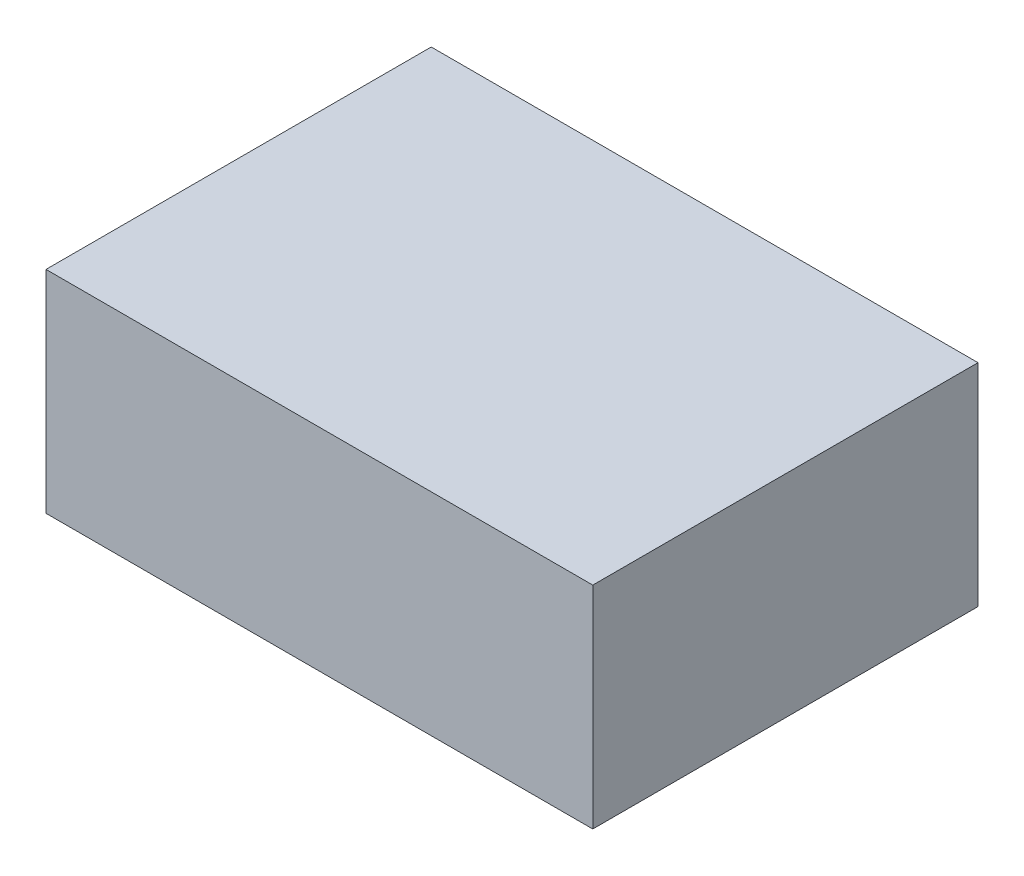
ISO-10303-21;
HEADER;
FILE_DESCRIPTION(('STEP AP214'),'2;1');
FILE_NAME('part.step','',(''),(''),'','','');
FILE_SCHEMA(('AUTOMOTIVE_DESIGN { 1 0 10303 214 1 1 1 1 }'));
ENDSEC;
DATA;
#1=APPLICATION_CONTEXT('core data for automotive mechanical design processes');
#2=APPLICATION_PROTOCOL_DEFINITION('international standard','automotive_design',2000,#1);
#3=PRODUCT_CONTEXT('',#1,'mechanical');
#4=PRODUCT('Part','Part','',(#3));
#5=PRODUCT_RELATED_PRODUCT_CATEGORY('part','',(#4));
#6=PRODUCT_DEFINITION_FORMATION('','',#4);
#7=PRODUCT_DEFINITION_CONTEXT('part definition',#1,'design');
#8=PRODUCT_DEFINITION('design','',#6,#7);
#9=PRODUCT_DEFINITION_SHAPE('','',#8);
#10=(LENGTH_UNIT() NAMED_UNIT(*) SI_UNIT(.MILLI.,.METRE.));
#11=(NAMED_UNIT(*) PLANE_ANGLE_UNIT() SI_UNIT($,.RADIAN.));
#12=(NAMED_UNIT(*) SI_UNIT($,.STERADIAN.) SOLID_ANGLE_UNIT());
#13=UNCERTAINTY_MEASURE_WITH_UNIT(LENGTH_MEASURE(1.E-05),#10,'distance_accuracy_value','');
#14=(GEOMETRIC_REPRESENTATION_CONTEXT(3) GLOBAL_UNCERTAINTY_ASSIGNED_CONTEXT((#13)) GLOBAL_UNIT_ASSIGNED_CONTEXT((#10,
#11,#12)) REPRESENTATION_CONTEXT('',''));
#15=CARTESIAN_POINT('',(0.,0.,0.));
#16=DIRECTION('',(0.,0.,1.));
#17=DIRECTION('',(1.,0.,0.));
#18=AXIS2_PLACEMENT_3D('',#15,#16,#17);
#19=CARTESIAN_POINT('',(0.,1.,15.5));
#20=DIRECTION('',(0.,0.,-1.));
#21=DIRECTION('',(-1.,0.,0.));
#22=AXIS2_PLACEMENT_3D('',#19,#20,#21);
#23=PLANE('',#22);
#24=DIRECTION('',(-1.,0.,0.));
#25=VECTOR('',#24,1.);
#26=CARTESIAN_POINT('',(0.,1.,15.5));
#27=LINE('',#26,#25);
#28=CARTESIAN_POINT('',(22.,1.,15.5));
#29=VERTEX_POINT('',#28);
#30=CARTESIAN_POINT('',(0.,1.,15.5));
#31=VERTEX_POINT('',#30);
#32=EDGE_CURVE('E221',#29,#31,#27,.T.);
#33=ORIENTED_EDGE('',*,*,#32,.F.);
#34=DIRECTION('',(0.,-1.,0.));
#35=VECTOR('',#34,1.);
#36=CARTESIAN_POINT('',(22.,1.,15.5));
#37=LINE('',#36,#35);
#38=CARTESIAN_POINT('',(22.,9.5,15.5));
#39=VERTEX_POINT('',#38);
#40=EDGE_CURVE('E62',#39,#29,#37,.T.);
#41=ORIENTED_EDGE('',*,*,#40,.F.);
#42=DIRECTION('',(1.,0.,0.));
#43=VECTOR('',#42,1.);
#44=CARTESIAN_POINT('',(0.,9.5,15.5));
#45=LINE('',#44,#43);
#46=CARTESIAN_POINT('',(0.,9.5,15.5));
#47=VERTEX_POINT('',#46);
#48=EDGE_CURVE('E47',#47,#39,#45,.T.);
#49=ORIENTED_EDGE('',*,*,#48,.F.);
#50=DIRECTION('',(0.,-1.,0.));
#51=VECTOR('',#50,1.);
#52=CARTESIAN_POINT('',(0.,1.,15.5));
#53=LINE('',#52,#51);
#54=EDGE_CURVE('E55',#47,#31,#53,.T.);
#55=ORIENTED_EDGE('',*,*,#54,.T.);
#56=EDGE_LOOP('',(#33,#41,#49,#55));
#57=FACE_BOUND('',#56,.T.);
#58=ADVANCED_FACE('F38',(#57),#23,.F.);
#59=CARTESIAN_POINT('',(22.,1.,0.));
#60=DIRECTION('',(-1.,0.,0.));
#61=DIRECTION('',(0.,0.,1.));
#62=AXIS2_PLACEMENT_3D('',#59,#60,#61);
#63=PLANE('',#62);
#64=DIRECTION('',(0.,0.,1.));
#65=VECTOR('',#64,1.);
#66=CARTESIAN_POINT('',(22.,1.,0.));
#67=LINE('',#66,#65);
#68=CARTESIAN_POINT('',(22.,1.,0.));
#69=VERTEX_POINT('',#68);
#70=EDGE_CURVE('E151',#69,#29,#67,.T.);
#71=ORIENTED_EDGE('',*,*,#70,.F.);
#72=DIRECTION('',(0.,-1.,0.));
#73=VECTOR('',#72,1.);
#74=CARTESIAN_POINT('',(22.,1.,0.));
#75=LINE('',#74,#73);
#76=CARTESIAN_POINT('',(22.,9.5,0.));
#77=VERTEX_POINT('',#76);
#78=EDGE_CURVE('E226',#77,#69,#75,.T.);
#79=ORIENTED_EDGE('',*,*,#78,.F.);
#80=DIRECTION('',(0.,0.,-1.));
#81=VECTOR('',#80,1.);
#82=CARTESIAN_POINT('',(22.,9.5,0.));
#83=LINE('',#82,#81);
#84=EDGE_CURVE('E212',#39,#77,#83,.T.);
#85=ORIENTED_EDGE('',*,*,#84,.F.);
#86=ORIENTED_EDGE('',*,*,#40,.T.);
#87=EDGE_LOOP('',(#71,#79,#85,#86));
#88=FACE_BOUND('',#87,.T.);
#89=ADVANCED_FACE('F243',(#88),#63,.F.);
#90=CARTESIAN_POINT('',(0.,9.5,0.));
#91=DIRECTION('',(0.,1.,0.));
#92=DIRECTION('',(0.,0.,1.));
#93=AXIS2_PLACEMENT_3D('',#90,#91,#92);
#94=PLANE('',#93);
#95=DIRECTION('',(0.,0.,1.));
#96=VECTOR('',#95,1.);
#97=CARTESIAN_POINT('',(0.,9.5,0.));
#98=LINE('',#97,#96);
#99=CARTESIAN_POINT('',(0.,9.5,0.));
#100=VERTEX_POINT('',#99);
#101=EDGE_CURVE('E11',#100,#47,#98,.T.);
#102=ORIENTED_EDGE('',*,*,#101,.T.);
#103=ORIENTED_EDGE('',*,*,#48,.T.);
#104=ORIENTED_EDGE('',*,*,#84,.T.);
#105=DIRECTION('',(-1.,0.,0.));
#106=VECTOR('',#105,1.);
#107=CARTESIAN_POINT('',(0.,9.5,0.));
#108=LINE('',#107,#106);
#109=EDGE_CURVE('E201',#77,#100,#108,.T.);
#110=ORIENTED_EDGE('',*,*,#109,.T.);
#111=EDGE_LOOP('',(#102,#103,#104,#110));
#112=FACE_BOUND('',#111,.T.);
#113=ADVANCED_FACE('F247',(#112),#94,.T.);
#114=CARTESIAN_POINT('',(0.,1.,0.));
#115=DIRECTION('',(1.,0.,0.));
#116=DIRECTION('',(0.,0.,-1.));
#117=AXIS2_PLACEMENT_3D('',#114,#115,#116);
#118=PLANE('',#117);
#119=DIRECTION('',(0.,0.,-1.));
#120=VECTOR('',#119,1.);
#121=CARTESIAN_POINT('',(0.,1.,0.));
#122=LINE('',#121,#120);
#123=CARTESIAN_POINT('',(0.,1.,0.));
#124=VERTEX_POINT('',#123);
#125=EDGE_CURVE('E150',#31,#124,#122,.T.);
#126=ORIENTED_EDGE('',*,*,#125,.F.);
#127=ORIENTED_EDGE('',*,*,#54,.F.);
#128=ORIENTED_EDGE('',*,*,#101,.F.);
#129=DIRECTION('',(0.,-1.,0.));
#130=VECTOR('',#129,1.);
#131=CARTESIAN_POINT('',(0.,1.,0.));
#132=LINE('',#131,#130);
#133=EDGE_CURVE('E162',#100,#124,#132,.T.);
#134=ORIENTED_EDGE('',*,*,#133,.T.);
#135=EDGE_LOOP('',(#126,#127,#128,#134));
#136=FACE_BOUND('',#135,.T.);
#137=ADVANCED_FACE('F245',(#136),#118,.F.);
#138=CARTESIAN_POINT('',(17.05,6.,0.));
#139=DIRECTION('',(1.,0.,0.));
#140=DIRECTION('',(0.,0.,-1.));
#141=AXIS2_PLACEMENT_3D('',#138,#139,#140);
#142=PLANE('',#141);
#143=DIRECTION('',(0.,0.,1.));
#144=VECTOR('',#143,1.);
#145=CARTESIAN_POINT('',(17.05,1.,0.));
#146=LINE('',#145,#144);
#147=CARTESIAN_POINT('',(17.05,1.,0.));
#148=VERTEX_POINT('',#147);
#149=CARTESIAN_POINT('',(17.05,1.,1.));
#150=VERTEX_POINT('',#149);
#151=EDGE_CURVE('E198',#148,#150,#146,.T.);
#152=ORIENTED_EDGE('',*,*,#151,.T.);
#153=DIRECTION('',(0.,-1.,0.));
#154=VECTOR('',#153,1.);
#155=CARTESIAN_POINT('',(17.05,6.,1.));
#156=LINE('',#155,#154);
#157=CARTESIAN_POINT('',(17.05,6.,1.));
#158=VERTEX_POINT('',#157);
#159=EDGE_CURVE('E187',#158,#150,#156,.T.);
#160=ORIENTED_EDGE('',*,*,#159,.F.);
#161=DIRECTION('',(0.,0.,1.));
#162=VECTOR('',#161,1.);
#163=CARTESIAN_POINT('',(17.05,6.,0.));
#164=LINE('',#163,#162);
#165=CARTESIAN_POINT('',(17.05,6.,0.));
#166=VERTEX_POINT('',#165);
#167=EDGE_CURVE('E194',#166,#158,#164,.T.);
#168=ORIENTED_EDGE('',*,*,#167,.F.);
#169=DIRECTION('',(0.,-1.,0.));
#170=VECTOR('',#169,1.);
#171=CARTESIAN_POINT('',(17.05,6.,0.));
#172=LINE('',#171,#170);
#173=EDGE_CURVE('E230',#166,#148,#172,.T.);
#174=ORIENTED_EDGE('',*,*,#173,.T.);
#175=EDGE_LOOP('',(#152,#160,#168,#174));
#176=FACE_BOUND('',#175,.T.);
#177=ADVANCED_FACE('F241',(#176),#142,.F.);
#178=CARTESIAN_POINT('',(21.,6.,0.));
#179=DIRECTION('',(1.,0.,0.));
#180=DIRECTION('',(0.,0.,-1.));
#181=AXIS2_PLACEMENT_3D('',#178,#179,#180);
#182=PLANE('',#181);
#183=DIRECTION('',(0.,0.,1.));
#184=VECTOR('',#183,1.);
#185=CARTESIAN_POINT('',(21.,1.,0.));
#186=LINE('',#185,#184);
#187=CARTESIAN_POINT('',(21.,1.,1.));
#188=VERTEX_POINT('',#187);
#189=CARTESIAN_POINT('',(21.,1.,14.5));
#190=VERTEX_POINT('',#189);
#191=EDGE_CURVE('E171',#188,#190,#186,.T.);
#192=ORIENTED_EDGE('',*,*,#191,.T.);
#193=DIRECTION('',(0.,-1.,0.));
#194=VECTOR('',#193,1.);
#195=CARTESIAN_POINT('',(21.,6.,14.5));
#196=LINE('',#195,#194);
#197=CARTESIAN_POINT('',(21.,8.,14.5));
#198=VERTEX_POINT('',#197);
#199=EDGE_CURVE('E177',#198,#190,#196,.T.);
#200=ORIENTED_EDGE('',*,*,#199,.F.);
#201=DIRECTION('',(0.,0.,-1.));
#202=VECTOR('',#201,1.);
#203=CARTESIAN_POINT('',(21.,8.,14.5));
#204=LINE('',#203,#202);
#205=CARTESIAN_POINT('',(21.,8.,1.));
#206=VERTEX_POINT('',#205);
#207=EDGE_CURVE('E205',#198,#206,#204,.T.);
#208=ORIENTED_EDGE('',*,*,#207,.T.);
#209=DIRECTION('',(0.,-1.,0.));
#210=VECTOR('',#209,1.);
#211=CARTESIAN_POINT('',(21.,6.,1.));
#212=LINE('',#211,#210);
#213=EDGE_CURVE('E183',#206,#188,#212,.T.);
#214=ORIENTED_EDGE('',*,*,#213,.T.);
#215=EDGE_LOOP('',(#192,#200,#208,#214));
#216=FACE_BOUND('',#215,.T.);
#217=ADVANCED_FACE('F253',(#216),#182,.F.);
#218=CARTESIAN_POINT('',(0.,6.,14.5));
#219=DIRECTION('',(0.,0.,-1.));
#220=DIRECTION('',(-1.,0.,0.));
#221=AXIS2_PLACEMENT_3D('',#218,#219,#220);
#222=PLANE('',#221);
#223=DIRECTION('',(1.,0.,0.));
#224=VECTOR('',#223,1.);
#225=CARTESIAN_POINT('',(0.,1.,14.5));
#226=LINE('',#225,#224);
#227=CARTESIAN_POINT('',(1.,1.,14.5));
#228=VERTEX_POINT('',#227);
#229=EDGE_CURVE('E42',#228,#190,#226,.T.);
#230=ORIENTED_EDGE('',*,*,#229,.F.);
#231=DIRECTION('',(0.,-1.,0.));
#232=VECTOR('',#231,1.);
#233=CARTESIAN_POINT('',(1.,6.,14.5));
#234=LINE('',#233,#232);
#235=CARTESIAN_POINT('',(1.,8.,14.5));
#236=VERTEX_POINT('',#235);
#237=EDGE_CURVE('E182',#236,#228,#234,.T.);
#238=ORIENTED_EDGE('',*,*,#237,.F.);
#239=DIRECTION('',(1.,0.,0.));
#240=VECTOR('',#239,1.);
#241=CARTESIAN_POINT('',(1.,8.,14.5));
#242=LINE('',#241,#240);
#243=EDGE_CURVE('E179',#236,#198,#242,.T.);
#244=ORIENTED_EDGE('',*,*,#243,.T.);
#245=ORIENTED_EDGE('',*,*,#199,.T.);
#246=EDGE_LOOP('',(#230,#238,#244,#245));
#247=FACE_BOUND('',#246,.T.);
#248=ADVANCED_FACE('F178',(#247),#222,.T.);
#249=CARTESIAN_POINT('',(0.,8.,0.));
#250=DIRECTION('',(0.,1.,0.));
#251=DIRECTION('',(0.,0.,1.));
#252=AXIS2_PLACEMENT_3D('',#249,#250,#251);
#253=PLANE('',#252);
#254=ORIENTED_EDGE('',*,*,#243,.F.);
#255=DIRECTION('',(0.,0.,1.));
#256=VECTOR('',#255,1.);
#257=CARTESIAN_POINT('',(1.,8.,1.));
#258=LINE('',#257,#256);
#259=CARTESIAN_POINT('',(1.,8.,1.));
#260=VERTEX_POINT('',#259);
#261=EDGE_CURVE('E202',#260,#236,#258,.T.);
#262=ORIENTED_EDGE('',*,*,#261,.F.);
#263=DIRECTION('',(-1.,0.,0.));
#264=VECTOR('',#263,1.);
#265=CARTESIAN_POINT('',(21.,8.,1.));
#266=LINE('',#265,#264);
#267=EDGE_CURVE('E197',#206,#260,#266,.T.);
#268=ORIENTED_EDGE('',*,*,#267,.F.);
#269=ORIENTED_EDGE('',*,*,#207,.F.);
#270=EDGE_LOOP('',(#254,#262,#268,#269));
#271=FACE_BOUND('',#270,.T.);
#272=ADVANCED_FACE('F324',(#271),#253,.F.);
#273=CARTESIAN_POINT('',(0.,6.,1.));
#274=DIRECTION('',(0.,0.,-1.));
#275=DIRECTION('',(-1.,0.,0.));
#276=AXIS2_PLACEMENT_3D('',#273,#274,#275);
#277=PLANE('',#276);
#278=DIRECTION('',(1.,0.,0.));
#279=VECTOR('',#278,1.);
#280=CARTESIAN_POINT('',(0.,1.,1.));
#281=LINE('',#280,#279);
#282=EDGE_CURVE('E217',#150,#188,#281,.T.);
#283=ORIENTED_EDGE('',*,*,#282,.T.);
#284=ORIENTED_EDGE('',*,*,#213,.F.);
#285=ORIENTED_EDGE('',*,*,#267,.T.);
#286=DIRECTION('',(0.,-1.,0.));
#287=VECTOR('',#286,1.);
#288=CARTESIAN_POINT('',(1.,6.,1.));
#289=LINE('',#288,#287);
#290=CARTESIAN_POINT('',(1.,1.,1.));
#291=VERTEX_POINT('',#290);
#292=EDGE_CURVE('E185',#260,#291,#289,.T.);
#293=ORIENTED_EDGE('',*,*,#292,.T.);
#294=DIRECTION('',(-1.,0.,0.));
#295=VECTOR('',#294,1.);
#296=CARTESIAN_POINT('',(0.,1.,1.));
#297=LINE('',#296,#295);
#298=CARTESIAN_POINT('',(4.95,1.,1.));
#299=VERTEX_POINT('',#298);
#300=EDGE_CURVE('E156',#299,#291,#297,.T.);
#301=ORIENTED_EDGE('',*,*,#300,.F.);
#302=DIRECTION('',(0.,-1.,0.));
#303=VECTOR('',#302,1.);
#304=CARTESIAN_POINT('',(4.95,6.,1.));
#305=LINE('',#304,#303);
#306=CARTESIAN_POINT('',(4.95,6.,1.));
#307=VERTEX_POINT('',#306);
#308=EDGE_CURVE('E140',#307,#299,#305,.T.);
#309=ORIENTED_EDGE('',*,*,#308,.F.);
#310=DIRECTION('',(-1.,0.,0.));
#311=VECTOR('',#310,1.);
#312=CARTESIAN_POINT('',(21.,6.,1.));
#313=LINE('',#312,#311);
#314=EDGE_CURVE('E199',#158,#307,#313,.T.);
#315=ORIENTED_EDGE('',*,*,#314,.F.);
#316=ORIENTED_EDGE('',*,*,#159,.T.);
#317=EDGE_LOOP('',(#283,#284,#285,#293,#301,#309,#315,#316));
#318=FACE_BOUND('',#317,.T.);
#319=ADVANCED_FACE('F239',(#318),#277,.F.);
#320=CARTESIAN_POINT('',(0.,6.,0.));
#321=DIRECTION('',(0.,1.,0.));
#322=DIRECTION('',(0.,0.,1.));
#323=AXIS2_PLACEMENT_3D('',#320,#321,#322);
#324=PLANE('',#323);
#325=DIRECTION('',(-1.,0.,0.));
#326=VECTOR('',#325,1.);
#327=CARTESIAN_POINT('',(22.,6.,0.));
#328=LINE('',#327,#326);
#329=CARTESIAN_POINT('',(4.95,6.,0.));
#330=VERTEX_POINT('',#329);
#331=EDGE_CURVE('E135',#166,#330,#328,.T.);
#332=ORIENTED_EDGE('',*,*,#331,.F.);
#333=ORIENTED_EDGE('',*,*,#167,.T.);
#334=ORIENTED_EDGE('',*,*,#314,.T.);
#335=DIRECTION('',(0.,0.,1.));
#336=VECTOR('',#335,1.);
#337=CARTESIAN_POINT('',(4.95,6.,0.));
#338=LINE('',#337,#336);
#339=EDGE_CURVE('E139',#330,#307,#338,.T.);
#340=ORIENTED_EDGE('',*,*,#339,.F.);
#341=EDGE_LOOP('',(#332,#333,#334,#340));
#342=FACE_BOUND('',#341,.T.);
#343=ADVANCED_FACE('F344',(#342),#324,.F.);
#344=CARTESIAN_POINT('',(0.,1.,0.));
#345=DIRECTION('',(0.,0.,1.));
#346=DIRECTION('',(1.,0.,0.));
#347=AXIS2_PLACEMENT_3D('',#344,#345,#346);
#348=PLANE('',#347);
#349=DIRECTION('',(1.,0.,0.));
#350=VECTOR('',#349,1.);
#351=CARTESIAN_POINT('',(0.,1.,0.));
#352=LINE('',#351,#350);
#353=CARTESIAN_POINT('',(4.95,1.,0.));
#354=VERTEX_POINT('',#353);
#355=EDGE_CURVE('E133',#124,#354,#352,.T.);
#356=ORIENTED_EDGE('',*,*,#355,.F.);
#357=ORIENTED_EDGE('',*,*,#133,.F.);
#358=ORIENTED_EDGE('',*,*,#109,.F.);
#359=ORIENTED_EDGE('',*,*,#78,.T.);
#360=EDGE_CURVE('E152',#148,#69,#352,.T.);
#361=ORIENTED_EDGE('',*,*,#360,.F.);
#362=ORIENTED_EDGE('',*,*,#173,.F.);
#363=ORIENTED_EDGE('',*,*,#331,.T.);
#364=DIRECTION('',(0.,-1.,0.));
#365=VECTOR('',#364,1.);
#366=CARTESIAN_POINT('',(4.95,6.,0.));
#367=LINE('',#366,#365);
#368=EDGE_CURVE('E131',#330,#354,#367,.T.);
#369=ORIENTED_EDGE('',*,*,#368,.T.);
#370=EDGE_LOOP('',(#356,#357,#358,#359,#361,#362,#363,#369));
#371=FACE_BOUND('',#370,.T.);
#372=ADVANCED_FACE('F40',(#371),#348,.F.);
#373=CARTESIAN_POINT('',(4.95,6.,0.));
#374=DIRECTION('',(1.,0.,0.));
#375=DIRECTION('',(0.,0.,-1.));
#376=AXIS2_PLACEMENT_3D('',#373,#374,#375);
#377=PLANE('',#376);
#378=DIRECTION('',(0.,0.,1.));
#379=VECTOR('',#378,1.);
#380=CARTESIAN_POINT('',(4.95,1.,0.));
#381=LINE('',#380,#379);
#382=EDGE_CURVE('E147',#354,#299,#381,.T.);
#383=ORIENTED_EDGE('',*,*,#382,.F.);
#384=ORIENTED_EDGE('',*,*,#368,.F.);
#385=ORIENTED_EDGE('',*,*,#339,.T.);
#386=ORIENTED_EDGE('',*,*,#308,.T.);
#387=EDGE_LOOP('',(#383,#384,#385,#386));
#388=FACE_BOUND('',#387,.T.);
#389=ADVANCED_FACE('F154',(#388),#377,.T.);
#390=CARTESIAN_POINT('',(1.,6.,0.));
#391=DIRECTION('',(1.,0.,0.));
#392=DIRECTION('',(0.,0.,-1.));
#393=AXIS2_PLACEMENT_3D('',#390,#391,#392);
#394=PLANE('',#393);
#395=DIRECTION('',(0.,0.,1.));
#396=VECTOR('',#395,1.);
#397=CARTESIAN_POINT('',(1.,1.,0.));
#398=LINE('',#397,#396);
#399=EDGE_CURVE('E159',#291,#228,#398,.T.);
#400=ORIENTED_EDGE('',*,*,#399,.F.);
#401=ORIENTED_EDGE('',*,*,#292,.F.);
#402=ORIENTED_EDGE('',*,*,#261,.T.);
#403=ORIENTED_EDGE('',*,*,#237,.T.);
#404=EDGE_LOOP('',(#400,#401,#402,#403));
#405=FACE_BOUND('',#404,.T.);
#406=ADVANCED_FACE('F260',(#405),#394,.T.);
#407=CARTESIAN_POINT('',(0.,1.,0.));
#408=DIRECTION('',(0.,-1.,0.));
#409=DIRECTION('',(0.,0.,-1.));
#410=AXIS2_PLACEMENT_3D('',#407,#408,#409);
#411=PLANE('',#410);
#412=ORIENTED_EDGE('',*,*,#125,.T.);
#413=ORIENTED_EDGE('',*,*,#355,.T.);
#414=ORIENTED_EDGE('',*,*,#382,.T.);
#415=ORIENTED_EDGE('',*,*,#300,.T.);
#416=ORIENTED_EDGE('',*,*,#399,.T.);
#417=ORIENTED_EDGE('',*,*,#229,.T.);
#418=ORIENTED_EDGE('',*,*,#191,.F.);
#419=ORIENTED_EDGE('',*,*,#282,.F.);
#420=ORIENTED_EDGE('',*,*,#151,.F.);
#421=ORIENTED_EDGE('',*,*,#360,.T.);
#422=ORIENTED_EDGE('',*,*,#70,.T.);
#423=ORIENTED_EDGE('',*,*,#32,.T.);
#424=EDGE_LOOP('',(#412,#413,#414,#415,#416,#417,#418,#419,#420,#421,#422,#423));
#425=FACE_BOUND('',#424,.T.);
#426=ADVANCED_FACE('F145',(#425),#411,.T.);
#427=CLOSED_SHELL('',(#58,#89,#113,#137,#177,#217,#248,#272,#319,#343,#372,#389,#406,#426));
#428=MANIFOLD_SOLID_BREP('B2',#427);
#429=ADVANCED_BREP_SHAPE_REPRESENTATION('',(#18,#428),#14);
#430=SHAPE_DEFINITION_REPRESENTATION(#9,#429);
ENDSEC;
END-ISO-10303-21;
